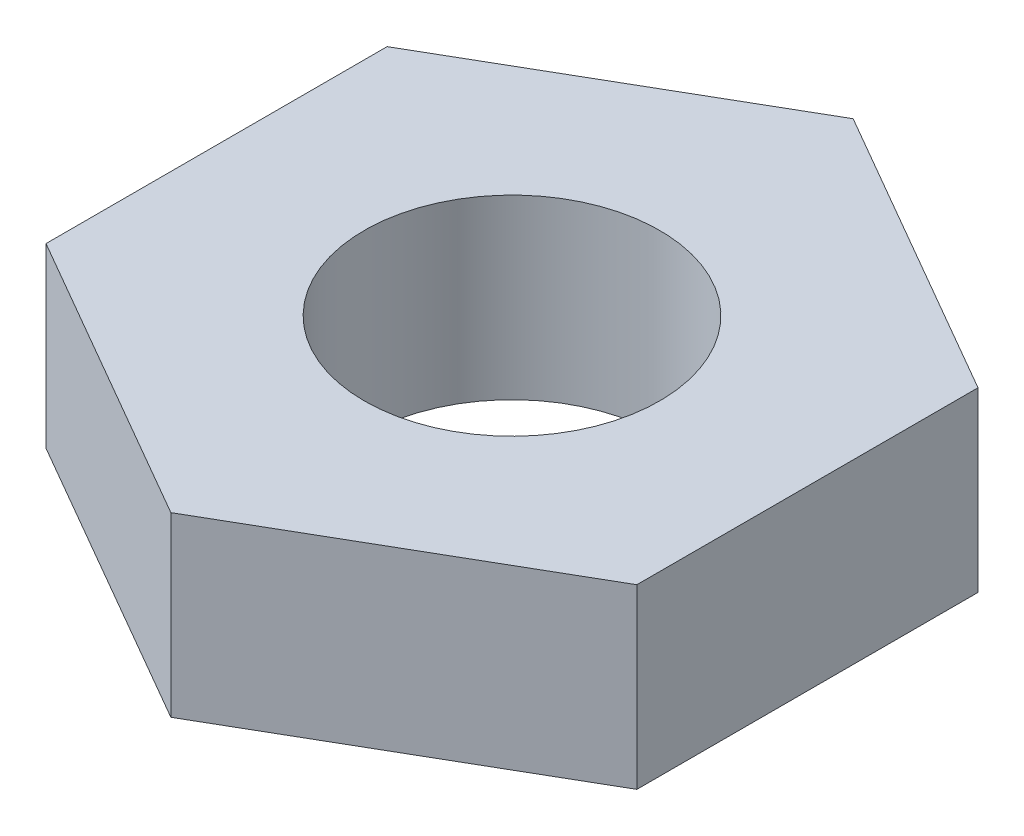
ISO-10303-21;
HEADER;
FILE_DESCRIPTION(('STEP AP214'),'2;1');
FILE_NAME('part.step','',(''),(''),'','','');
FILE_SCHEMA(('AUTOMOTIVE_DESIGN { 1 0 10303 214 1 1 1 1 }'));
ENDSEC;
DATA;
#1=APPLICATION_CONTEXT('core data for automotive mechanical design processes');
#2=APPLICATION_PROTOCOL_DEFINITION('international standard','automotive_design',2000,#1);
#3=PRODUCT_CONTEXT('',#1,'mechanical');
#4=PRODUCT('Part','Part','',(#3));
#5=PRODUCT_RELATED_PRODUCT_CATEGORY('part','',(#4));
#6=PRODUCT_DEFINITION_FORMATION('','',#4);
#7=PRODUCT_DEFINITION_CONTEXT('part definition',#1,'design');
#8=PRODUCT_DEFINITION('design','',#6,#7);
#9=PRODUCT_DEFINITION_SHAPE('','',#8);
#10=(LENGTH_UNIT() NAMED_UNIT(*) SI_UNIT(.MILLI.,.METRE.));
#11=(NAMED_UNIT(*) PLANE_ANGLE_UNIT() SI_UNIT($,.RADIAN.));
#12=(NAMED_UNIT(*) SI_UNIT($,.STERADIAN.) SOLID_ANGLE_UNIT());
#13=UNCERTAINTY_MEASURE_WITH_UNIT(LENGTH_MEASURE(1.E-05),#10,'distance_accuracy_value','');
#14=(GEOMETRIC_REPRESENTATION_CONTEXT(3) GLOBAL_UNCERTAINTY_ASSIGNED_CONTEXT((#13)) GLOBAL_UNIT_ASSIGNED_CONTEXT((#10,
#11,#12)) REPRESENTATION_CONTEXT('',''));
#15=CARTESIAN_POINT('',(0.,0.,0.));
#16=DIRECTION('',(0.,0.,1.));
#17=DIRECTION('',(1.,0.,0.));
#18=AXIS2_PLACEMENT_3D('',#15,#16,#17);
#19=CARTESIAN_POINT('',(0.,1.2,0.));
#20=DIRECTION('',(0.,1.,0.));
#21=DIRECTION('',(0.,0.,1.));
#22=AXIS2_PLACEMENT_3D('',#19,#20,#21);
#23=PLANE('',#22);
#24=DIRECTION('',(-0.866025403784439,0.,-0.5));
#25=VECTOR('',#24,1.);
#26=CARTESIAN_POINT('',(2.,1.2,-1.15470053837925));
#27=LINE('',#26,#25);
#28=CARTESIAN_POINT('',(2.,1.2,-1.15470053837925));
#29=VERTEX_POINT('',#28);
#30=CARTESIAN_POINT('',(0.,1.2,-2.3094010767585));
#31=VERTEX_POINT('',#30);
#32=EDGE_CURVE('E137',#29,#31,#27,.T.);
#33=ORIENTED_EDGE('',*,*,#32,.T.);
#34=DIRECTION('',(-0.866025403784439,0.,0.5));
#35=VECTOR('',#34,1.);
#36=CARTESIAN_POINT('',(0.,1.2,-2.3094010767585));
#37=LINE('',#36,#35);
#38=CARTESIAN_POINT('',(-2.,1.2,-1.15470053837925));
#39=VERTEX_POINT('',#38);
#40=EDGE_CURVE('E95',#31,#39,#37,.T.);
#41=ORIENTED_EDGE('',*,*,#40,.T.);
#42=DIRECTION('',(0.,0.,1.));
#43=VECTOR('',#42,1.);
#44=CARTESIAN_POINT('',(-2.,1.2,-1.15470053837925));
#45=LINE('',#44,#43);
#46=CARTESIAN_POINT('',(-2.,1.2,1.15470053837925));
#47=VERTEX_POINT('',#46);
#48=EDGE_CURVE('E108',#39,#47,#45,.T.);
#49=ORIENTED_EDGE('',*,*,#48,.T.);
#50=DIRECTION('',(0.866025403784439,0.,0.5));
#51=VECTOR('',#50,1.);
#52=CARTESIAN_POINT('',(-2.,1.2,1.15470053837925));
#53=LINE('',#52,#51);
#54=CARTESIAN_POINT('',(0.,1.2,2.3094010767585));
#55=VERTEX_POINT('',#54);
#56=EDGE_CURVE('E102',#47,#55,#53,.T.);
#57=ORIENTED_EDGE('',*,*,#56,.T.);
#58=DIRECTION('',(0.866025403784439,0.,-0.5));
#59=VECTOR('',#58,1.);
#60=CARTESIAN_POINT('',(0.,1.2,2.3094010767585));
#61=LINE('',#60,#59);
#62=CARTESIAN_POINT('',(2.,1.2,1.15470053837925));
#63=VERTEX_POINT('',#62);
#64=EDGE_CURVE('E106',#55,#63,#61,.T.);
#65=ORIENTED_EDGE('',*,*,#64,.T.);
#66=DIRECTION('',(0.,0.,-1.));
#67=VECTOR('',#66,1.);
#68=CARTESIAN_POINT('',(2.,1.2,1.15470053837925));
#69=LINE('',#68,#67);
#70=EDGE_CURVE('E58',#63,#29,#69,.T.);
#71=ORIENTED_EDGE('',*,*,#70,.T.);
#72=EDGE_LOOP('',(#33,#41,#49,#57,#65,#71));
#73=FACE_BOUND('',#72,.T.);
#74=CARTESIAN_POINT('',(0.,1.2,0.));
#75=DIRECTION('',(0.,1.,0.));
#76=DIRECTION('',(0.,0.,1.));
#77=AXIS2_PLACEMENT_3D('',#74,#75,#76);
#78=CIRCLE('',#77,1.);
#79=CARTESIAN_POINT('',(0.,1.2,1.));
#80=VERTEX_POINT('',#79);
#81=EDGE_CURVE('E130',#80,#80,#78,.T.);
#82=ORIENTED_EDGE('',*,*,#81,.F.);
#83=EDGE_LOOP('',(#82));
#84=FACE_BOUND('',#83,.T.);
#85=ADVANCED_FACE('F41',(#73,#84),#23,.T.);
#86=CARTESIAN_POINT('',(0.,0.,0.));
#87=DIRECTION('',(0.,1.,0.));
#88=DIRECTION('',(0.,0.,1.));
#89=AXIS2_PLACEMENT_3D('',#86,#87,#88);
#90=PLANE('',#89);
#91=DIRECTION('',(-0.866025403784439,0.,-0.5));
#92=VECTOR('',#91,1.);
#93=CARTESIAN_POINT('',(2.,0.,-1.15470053837925));
#94=LINE('',#93,#92);
#95=CARTESIAN_POINT('',(2.,0.,-1.15470053837925));
#96=VERTEX_POINT('',#95);
#97=CARTESIAN_POINT('',(0.,0.,-2.3094010767585));
#98=VERTEX_POINT('',#97);
#99=EDGE_CURVE('E126',#96,#98,#94,.T.);
#100=ORIENTED_EDGE('',*,*,#99,.F.);
#101=DIRECTION('',(0.,0.,-1.));
#102=VECTOR('',#101,1.);
#103=CARTESIAN_POINT('',(2.,0.,1.15470053837925));
#104=LINE('',#103,#102);
#105=CARTESIAN_POINT('',(2.,0.,1.15470053837925));
#106=VERTEX_POINT('',#105);
#107=EDGE_CURVE('E87',#106,#96,#104,.T.);
#108=ORIENTED_EDGE('',*,*,#107,.F.);
#109=DIRECTION('',(0.866025403784439,0.,-0.5));
#110=VECTOR('',#109,1.);
#111=CARTESIAN_POINT('',(0.,0.,2.3094010767585));
#112=LINE('',#111,#110);
#113=CARTESIAN_POINT('',(0.,0.,2.3094010767585));
#114=VERTEX_POINT('',#113);
#115=EDGE_CURVE('E81',#114,#106,#112,.T.);
#116=ORIENTED_EDGE('',*,*,#115,.F.);
#117=DIRECTION('',(0.866025403784439,0.,0.5));
#118=VECTOR('',#117,1.);
#119=CARTESIAN_POINT('',(-2.,0.,1.15470053837925));
#120=LINE('',#119,#118);
#121=CARTESIAN_POINT('',(-2.,0.,1.15470053837925));
#122=VERTEX_POINT('',#121);
#123=EDGE_CURVE('E116',#122,#114,#120,.T.);
#124=ORIENTED_EDGE('',*,*,#123,.F.);
#125=DIRECTION('',(0.,0.,1.));
#126=VECTOR('',#125,1.);
#127=CARTESIAN_POINT('',(-2.,0.,-1.15470053837925));
#128=LINE('',#127,#126);
#129=CARTESIAN_POINT('',(-2.,0.,-1.15470053837925));
#130=VERTEX_POINT('',#129);
#131=EDGE_CURVE('E132',#130,#122,#128,.T.);
#132=ORIENTED_EDGE('',*,*,#131,.F.);
#133=DIRECTION('',(-0.866025403784439,0.,0.5));
#134=VECTOR('',#133,1.);
#135=CARTESIAN_POINT('',(0.,0.,-2.3094010767585));
#136=LINE('',#135,#134);
#137=EDGE_CURVE('E129',#98,#130,#136,.T.);
#138=ORIENTED_EDGE('',*,*,#137,.F.);
#139=EDGE_LOOP('',(#100,#108,#116,#124,#132,#138));
#140=FACE_BOUND('',#139,.T.);
#141=CARTESIAN_POINT('',(0.,0.,0.));
#142=DIRECTION('',(0.,1.,0.));
#143=DIRECTION('',(0.,0.,1.));
#144=AXIS2_PLACEMENT_3D('',#141,#142,#143);
#145=CIRCLE('',#144,1.);
#146=CARTESIAN_POINT('',(0.,0.,1.));
#147=VERTEX_POINT('',#146);
#148=EDGE_CURVE('E230',#147,#147,#145,.T.);
#149=ORIENTED_EDGE('',*,*,#148,.T.);
#150=EDGE_LOOP('',(#149));
#151=FACE_BOUND('',#150,.T.);
#152=ADVANCED_FACE('F146',(#140,#151),#90,.F.);
#153=CARTESIAN_POINT('',(2.,1.2,-1.15470053837925));
#154=DIRECTION('',(-0.5,0.,0.866025403784439));
#155=DIRECTION('',(0.866025403784439,0.,0.5));
#156=AXIS2_PLACEMENT_3D('',#153,#154,#155);
#157=PLANE('',#156);
#158=ORIENTED_EDGE('',*,*,#99,.T.);
#159=DIRECTION('',(0.,-1.,0.));
#160=VECTOR('',#159,1.);
#161=CARTESIAN_POINT('',(0.,1.2,-2.3094010767585));
#162=LINE('',#161,#160);
#163=EDGE_CURVE('E11',#31,#98,#162,.T.);
#164=ORIENTED_EDGE('',*,*,#163,.F.);
#165=ORIENTED_EDGE('',*,*,#32,.F.);
#166=DIRECTION('',(0.,-1.,0.));
#167=VECTOR('',#166,1.);
#168=CARTESIAN_POINT('',(2.,1.2,-1.15470053837925));
#169=LINE('',#168,#167);
#170=EDGE_CURVE('E122',#29,#96,#169,.T.);
#171=ORIENTED_EDGE('',*,*,#170,.T.);
#172=EDGE_LOOP('',(#158,#164,#165,#171));
#173=FACE_BOUND('',#172,.T.);
#174=ADVANCED_FACE('F43',(#173),#157,.F.);
#175=CARTESIAN_POINT('',(0.,1.2,-2.3094010767585));
#176=DIRECTION('',(0.5,0.,0.866025403784439));
#177=DIRECTION('',(0.866025403784439,0.,-0.5));
#178=AXIS2_PLACEMENT_3D('',#175,#176,#177);
#179=PLANE('',#178);
#180=ORIENTED_EDGE('',*,*,#137,.T.);
#181=DIRECTION('',(0.,-1.,0.));
#182=VECTOR('',#181,1.);
#183=CARTESIAN_POINT('',(-2.,1.2,-1.15470053837925));
#184=LINE('',#183,#182);
#185=EDGE_CURVE('E50',#39,#130,#184,.T.);
#186=ORIENTED_EDGE('',*,*,#185,.F.);
#187=ORIENTED_EDGE('',*,*,#40,.F.);
#188=ORIENTED_EDGE('',*,*,#163,.T.);
#189=EDGE_LOOP('',(#180,#186,#187,#188));
#190=FACE_BOUND('',#189,.T.);
#191=ADVANCED_FACE('F171',(#190),#179,.F.);
#192=CARTESIAN_POINT('',(-2.,1.2,-1.15470053837925));
#193=DIRECTION('',(1.,0.,0.));
#194=DIRECTION('',(0.,0.,-1.));
#195=AXIS2_PLACEMENT_3D('',#192,#193,#194);
#196=PLANE('',#195);
#197=ORIENTED_EDGE('',*,*,#131,.T.);
#198=DIRECTION('',(0.,-1.,0.));
#199=VECTOR('',#198,1.);
#200=CARTESIAN_POINT('',(-2.,1.2,1.15470053837925));
#201=LINE('',#200,#199);
#202=EDGE_CURVE('E117',#47,#122,#201,.T.);
#203=ORIENTED_EDGE('',*,*,#202,.F.);
#204=ORIENTED_EDGE('',*,*,#48,.F.);
#205=ORIENTED_EDGE('',*,*,#185,.T.);
#206=EDGE_LOOP('',(#197,#203,#204,#205));
#207=FACE_BOUND('',#206,.T.);
#208=ADVANCED_FACE('F143',(#207),#196,.F.);
#209=CARTESIAN_POINT('',(-2.,1.2,1.15470053837925));
#210=DIRECTION('',(0.5,0.,-0.866025403784438));
#211=DIRECTION('',(-0.866025403784439,0.,-0.5));
#212=AXIS2_PLACEMENT_3D('',#209,#210,#211);
#213=PLANE('',#212);
#214=ORIENTED_EDGE('',*,*,#123,.T.);
#215=DIRECTION('',(0.,-1.,0.));
#216=VECTOR('',#215,1.);
#217=CARTESIAN_POINT('',(0.,1.2,2.3094010767585));
#218=LINE('',#217,#216);
#219=EDGE_CURVE('E113',#55,#114,#218,.T.);
#220=ORIENTED_EDGE('',*,*,#219,.F.);
#221=ORIENTED_EDGE('',*,*,#56,.F.);
#222=ORIENTED_EDGE('',*,*,#202,.T.);
#223=EDGE_LOOP('',(#214,#220,#221,#222));
#224=FACE_BOUND('',#223,.T.);
#225=ADVANCED_FACE('F114',(#224),#213,.F.);
#226=CARTESIAN_POINT('',(0.,1.2,2.3094010767585));
#227=DIRECTION('',(-0.5,0.,-0.866025403784439));
#228=DIRECTION('',(-0.866025403784439,0.,0.5));
#229=AXIS2_PLACEMENT_3D('',#226,#227,#228);
#230=PLANE('',#229);
#231=ORIENTED_EDGE('',*,*,#115,.T.);
#232=DIRECTION('',(0.,-1.,0.));
#233=VECTOR('',#232,1.);
#234=CARTESIAN_POINT('',(2.,1.2,1.15470053837925));
#235=LINE('',#234,#233);
#236=EDGE_CURVE('E118',#63,#106,#235,.T.);
#237=ORIENTED_EDGE('',*,*,#236,.F.);
#238=ORIENTED_EDGE('',*,*,#64,.F.);
#239=ORIENTED_EDGE('',*,*,#219,.T.);
#240=EDGE_LOOP('',(#231,#237,#238,#239));
#241=FACE_BOUND('',#240,.T.);
#242=ADVANCED_FACE('F120',(#241),#230,.F.);
#243=CARTESIAN_POINT('',(2.,1.2,1.15470053837925));
#244=DIRECTION('',(-1.,0.,0.));
#245=DIRECTION('',(0.,0.,1.));
#246=AXIS2_PLACEMENT_3D('',#243,#244,#245);
#247=PLANE('',#246);
#248=ORIENTED_EDGE('',*,*,#107,.T.);
#249=ORIENTED_EDGE('',*,*,#170,.F.);
#250=ORIENTED_EDGE('',*,*,#70,.F.);
#251=ORIENTED_EDGE('',*,*,#236,.T.);
#252=EDGE_LOOP('',(#248,#249,#250,#251));
#253=FACE_BOUND('',#252,.T.);
#254=ADVANCED_FACE('F151',(#253),#247,.F.);
#255=CARTESIAN_POINT('',(0.,1.2,0.));
#256=DIRECTION('',(0.,-1.,0.));
#257=DIRECTION('',(0.,0.,-1.));
#258=AXIS2_PLACEMENT_3D('',#255,#256,#257);
#259=CYLINDRICAL_SURFACE('',#258,1.);
#260=ORIENTED_EDGE('',*,*,#81,.T.);
#261=EDGE_LOOP('',(#260));
#262=FACE_BOUND('',#261,.T.);
#263=ORIENTED_EDGE('',*,*,#148,.F.);
#264=EDGE_LOOP('',(#263));
#265=FACE_BOUND('',#264,.T.);
#266=ADVANCED_FACE('F153',(#262,#265),#259,.F.);
#267=CLOSED_SHELL('',(#85,#152,#174,#191,#208,#225,#242,#254,#266));
#268=MANIFOLD_SOLID_BREP('B2',#267);
#269=ADVANCED_BREP_SHAPE_REPRESENTATION('',(#18,#268),#14);
#270=SHAPE_DEFINITION_REPRESENTATION(#9,#269);
ENDSEC;
END-ISO-10303-21;
